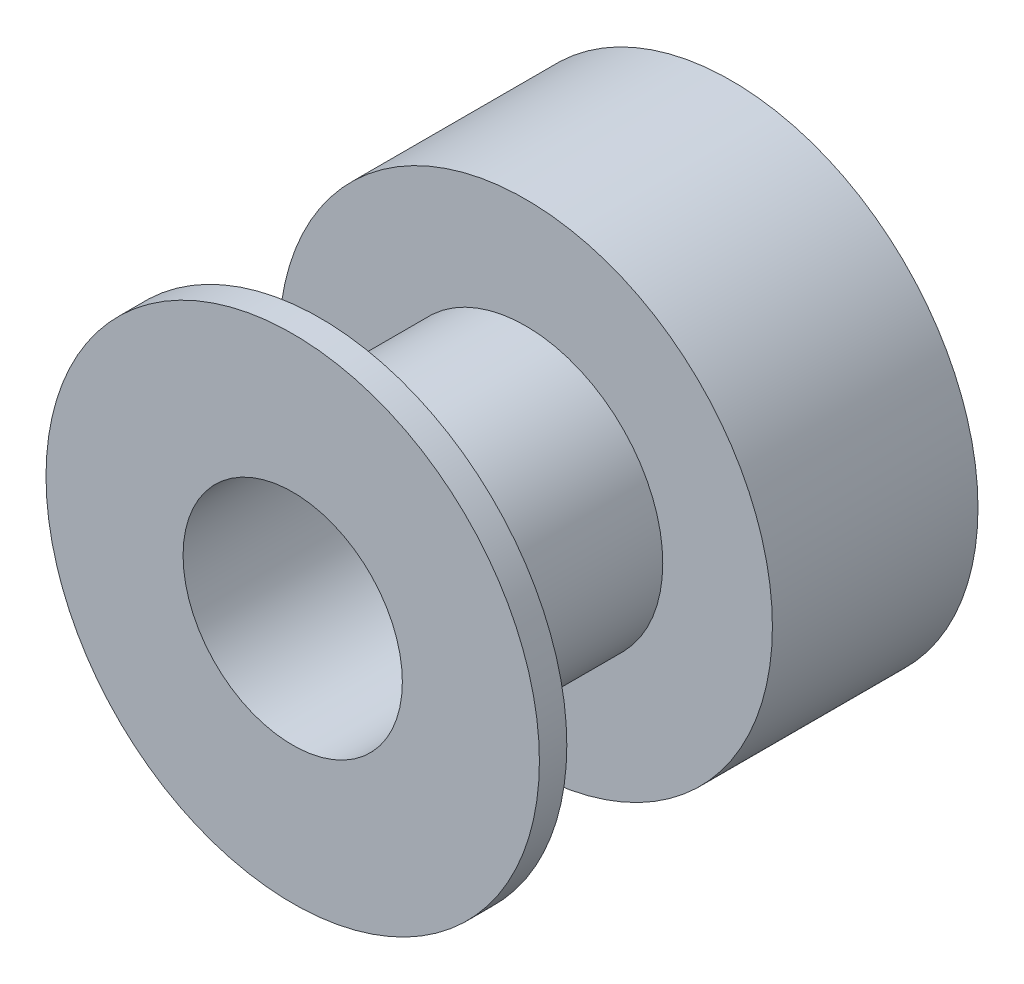
ISO-10303-21;
HEADER;
FILE_DESCRIPTION(('STEP AP214'),'2;1');
FILE_NAME('part.step','',(''),(''),'','','');
FILE_SCHEMA(('AUTOMOTIVE_DESIGN { 1 0 10303 214 1 1 1 1 }'));
ENDSEC;
DATA;
#1=APPLICATION_CONTEXT('core data for automotive mechanical design processes');
#2=APPLICATION_PROTOCOL_DEFINITION('international standard','automotive_design',2000,#1);
#3=PRODUCT_CONTEXT('',#1,'mechanical');
#4=PRODUCT('Part','Part','',(#3));
#5=PRODUCT_RELATED_PRODUCT_CATEGORY('part','',(#4));
#6=PRODUCT_DEFINITION_FORMATION('','',#4);
#7=PRODUCT_DEFINITION_CONTEXT('part definition',#1,'design');
#8=PRODUCT_DEFINITION('design','',#6,#7);
#9=PRODUCT_DEFINITION_SHAPE('','',#8);
#10=(LENGTH_UNIT() NAMED_UNIT(*) SI_UNIT(.MILLI.,.METRE.));
#11=(NAMED_UNIT(*) PLANE_ANGLE_UNIT() SI_UNIT($,.RADIAN.));
#12=(NAMED_UNIT(*) SI_UNIT($,.STERADIAN.) SOLID_ANGLE_UNIT());
#13=UNCERTAINTY_MEASURE_WITH_UNIT(LENGTH_MEASURE(1.E-05),#10,'distance_accuracy_value','');
#14=(GEOMETRIC_REPRESENTATION_CONTEXT(3) GLOBAL_UNCERTAINTY_ASSIGNED_CONTEXT((#13)) GLOBAL_UNIT_ASSIGNED_CONTEXT((#10,
#11,#12)) REPRESENTATION_CONTEXT('',''));
#15=CARTESIAN_POINT('',(0.,0.,0.));
#16=DIRECTION('',(0.,0.,1.));
#17=DIRECTION('',(1.,0.,0.));
#18=AXIS2_PLACEMENT_3D('',#15,#16,#17);
#19=CARTESIAN_POINT('',(0.,0.,7.5));
#20=DIRECTION('',(0.,0.,-1.));
#21=DIRECTION('',(-1.,0.,0.));
#22=AXIS2_PLACEMENT_3D('',#19,#20,#21);
#23=CYLINDRICAL_SURFACE('',#22,9.);
#24=CARTESIAN_POINT('',(0.,0.,7.5));
#25=DIRECTION('',(0.,0.,1.));
#26=DIRECTION('',(1.,0.,0.));
#27=AXIS2_PLACEMENT_3D('',#24,#25,#26);
#28=CIRCLE('',#27,9.);
#29=CARTESIAN_POINT('',(9.,0.,7.5));
#30=VERTEX_POINT('',#29);
#31=EDGE_CURVE('E39',#30,#30,#28,.T.);
#32=ORIENTED_EDGE('',*,*,#31,.F.);
#33=EDGE_LOOP('',(#32));
#34=FACE_BOUND('',#33,.T.);
#35=CARTESIAN_POINT('',(0.,0.,0.));
#36=DIRECTION('',(0.,0.,1.));
#37=DIRECTION('',(1.,0.,0.));
#38=AXIS2_PLACEMENT_3D('',#35,#36,#37);
#39=CIRCLE('',#38,9.);
#40=CARTESIAN_POINT('',(9.,0.,0.));
#41=VERTEX_POINT('',#40);
#42=EDGE_CURVE('E44',#41,#41,#39,.T.);
#43=ORIENTED_EDGE('',*,*,#42,.T.);
#44=EDGE_LOOP('',(#43));
#45=FACE_BOUND('',#44,.T.);
#46=ADVANCED_FACE('F32',(#34,#45),#23,.T.);
#47=CARTESIAN_POINT('',(0.,0.,7.5));
#48=DIRECTION('',(0.,0.,1.));
#49=DIRECTION('',(1.,0.,0.));
#50=AXIS2_PLACEMENT_3D('',#47,#48,#49);
#51=PLANE('',#50);
#52=CARTESIAN_POINT('',(0.,0.,7.5));
#53=DIRECTION('',(0.,0.,1.));
#54=DIRECTION('',(1.,0.,0.));
#55=AXIS2_PLACEMENT_3D('',#52,#53,#54);
#56=CIRCLE('',#55,5.);
#57=CARTESIAN_POINT('',(5.,0.,7.5));
#58=VERTEX_POINT('',#57);
#59=EDGE_CURVE('E10',#58,#58,#56,.T.);
#60=ORIENTED_EDGE('',*,*,#59,.F.);
#61=EDGE_LOOP('',(#60));
#62=FACE_BOUND('',#61,.T.);
#63=ORIENTED_EDGE('',*,*,#31,.T.);
#64=EDGE_LOOP('',(#63));
#65=FACE_BOUND('',#64,.T.);
#66=ADVANCED_FACE('F87',(#62,#65),#51,.T.);
#67=CARTESIAN_POINT('',(0.,0.,0.));
#68=DIRECTION('',(0.,0.,1.));
#69=DIRECTION('',(1.,0.,0.));
#70=AXIS2_PLACEMENT_3D('',#67,#68,#69);
#71=PLANE('',#70);
#72=CARTESIAN_POINT('',(0.,0.,0.));
#73=DIRECTION('',(0.,0.,-1.));
#74=DIRECTION('',(-1.,0.,0.));
#75=AXIS2_PLACEMENT_3D('',#72,#73,#74);
#76=CIRCLE('',#75,4.);
#77=CARTESIAN_POINT('',(-4.,0.,0.));
#78=VERTEX_POINT('',#77);
#79=EDGE_CURVE('E63',#78,#78,#76,.T.);
#80=ORIENTED_EDGE('',*,*,#79,.F.);
#81=EDGE_LOOP('',(#80));
#82=FACE_BOUND('',#81,.T.);
#83=ORIENTED_EDGE('',*,*,#42,.F.);
#84=EDGE_LOOP('',(#83));
#85=FACE_BOUND('',#84,.T.);
#86=ADVANCED_FACE('F92',(#82,#85),#71,.F.);
#87=CARTESIAN_POINT('',(0.,0.,15.));
#88=DIRECTION('',(0.,0.,-1.));
#89=DIRECTION('',(-1.,0.,0.));
#90=AXIS2_PLACEMENT_3D('',#87,#88,#89);
#91=CYLINDRICAL_SURFACE('',#90,5.);
#92=CARTESIAN_POINT('',(0.,0.,15.));
#93=DIRECTION('',(0.,0.,1.));
#94=DIRECTION('',(1.,0.,0.));
#95=AXIS2_PLACEMENT_3D('',#92,#93,#94);
#96=CIRCLE('',#95,5.);
#97=CARTESIAN_POINT('',(5.,0.,15.));
#98=VERTEX_POINT('',#97);
#99=EDGE_CURVE('E47',#98,#98,#96,.T.);
#100=ORIENTED_EDGE('',*,*,#99,.F.);
#101=EDGE_LOOP('',(#100));
#102=FACE_BOUND('',#101,.T.);
#103=ORIENTED_EDGE('',*,*,#59,.T.);
#104=EDGE_LOOP('',(#103));
#105=FACE_BOUND('',#104,.T.);
#106=ADVANCED_FACE('F82',(#102,#105),#91,.T.);
#107=CARTESIAN_POINT('',(0.,0.,16.));
#108=DIRECTION('',(0.,0.,-1.));
#109=DIRECTION('',(-1.,0.,0.));
#110=AXIS2_PLACEMENT_3D('',#107,#108,#109);
#111=CYLINDRICAL_SURFACE('',#110,9.);
#112=CARTESIAN_POINT('',(0.,0.,16.));
#113=DIRECTION('',(0.,0.,1.));
#114=DIRECTION('',(1.,0.,0.));
#115=AXIS2_PLACEMENT_3D('',#112,#113,#114);
#116=CIRCLE('',#115,9.);
#117=CARTESIAN_POINT('',(9.,0.,16.));
#118=VERTEX_POINT('',#117);
#119=EDGE_CURVE('E53',#118,#118,#116,.T.);
#120=ORIENTED_EDGE('',*,*,#119,.F.);
#121=EDGE_LOOP('',(#120));
#122=FACE_BOUND('',#121,.T.);
#123=CARTESIAN_POINT('',(0.,0.,15.));
#124=DIRECTION('',(0.,0.,1.));
#125=DIRECTION('',(1.,0.,0.));
#126=AXIS2_PLACEMENT_3D('',#123,#124,#125);
#127=CIRCLE('',#126,9.);
#128=CARTESIAN_POINT('',(9.,0.,15.));
#129=VERTEX_POINT('',#128);
#130=EDGE_CURVE('E57',#129,#129,#127,.T.);
#131=ORIENTED_EDGE('',*,*,#130,.T.);
#132=EDGE_LOOP('',(#131));
#133=FACE_BOUND('',#132,.T.);
#134=ADVANCED_FACE('F75',(#122,#133),#111,.T.);
#135=CARTESIAN_POINT('',(0.,0.,16.));
#136=DIRECTION('',(0.,0.,1.));
#137=DIRECTION('',(1.,0.,0.));
#138=AXIS2_PLACEMENT_3D('',#135,#136,#137);
#139=PLANE('',#138);
#140=CARTESIAN_POINT('',(0.,0.,16.));
#141=DIRECTION('',(0.,0.,1.));
#142=DIRECTION('',(1.,0.,0.));
#143=AXIS2_PLACEMENT_3D('',#140,#141,#142);
#144=CIRCLE('',#143,4.);
#145=CARTESIAN_POINT('',(4.,0.,16.));
#146=VERTEX_POINT('',#145);
#147=EDGE_CURVE('E35',#146,#146,#144,.T.);
#148=ORIENTED_EDGE('',*,*,#147,.F.);
#149=EDGE_LOOP('',(#148));
#150=FACE_BOUND('',#149,.T.);
#151=ORIENTED_EDGE('',*,*,#119,.T.);
#152=EDGE_LOOP('',(#151));
#153=FACE_BOUND('',#152,.T.);
#154=ADVANCED_FACE('F72',(#150,#153),#139,.T.);
#155=CARTESIAN_POINT('',(0.,0.,15.));
#156=DIRECTION('',(0.,0.,1.));
#157=DIRECTION('',(1.,0.,0.));
#158=AXIS2_PLACEMENT_3D('',#155,#156,#157);
#159=PLANE('',#158);
#160=ORIENTED_EDGE('',*,*,#99,.T.);
#161=EDGE_LOOP('',(#160));
#162=FACE_BOUND('',#161,.T.);
#163=ORIENTED_EDGE('',*,*,#130,.F.);
#164=EDGE_LOOP('',(#163));
#165=FACE_BOUND('',#164,.T.);
#166=ADVANCED_FACE('F74',(#162,#165),#159,.F.);
#167=CARTESIAN_POINT('',(0.,0.,20.));
#168=DIRECTION('',(0.,0.,-1.));
#169=DIRECTION('',(-1.,0.,0.));
#170=AXIS2_PLACEMENT_3D('',#167,#168,#169);
#171=CYLINDRICAL_SURFACE('',#170,4.);
#172=ORIENTED_EDGE('',*,*,#147,.T.);
#173=EDGE_LOOP('',(#172));
#174=FACE_BOUND('',#173,.T.);
#175=ORIENTED_EDGE('',*,*,#79,.T.);
#176=EDGE_LOOP('',(#175));
#177=FACE_BOUND('',#176,.T.);
#178=ADVANCED_FACE('F70',(#174,#177),#171,.F.);
#179=CLOSED_SHELL('',(#46,#66,#86,#106,#134,#154,#166,#178));
#180=MANIFOLD_SOLID_BREP('B2',#179);
#181=ADVANCED_BREP_SHAPE_REPRESENTATION('',(#18,#180),#14);
#182=SHAPE_DEFINITION_REPRESENTATION(#9,#181);
ENDSEC;
END-ISO-10303-21;
